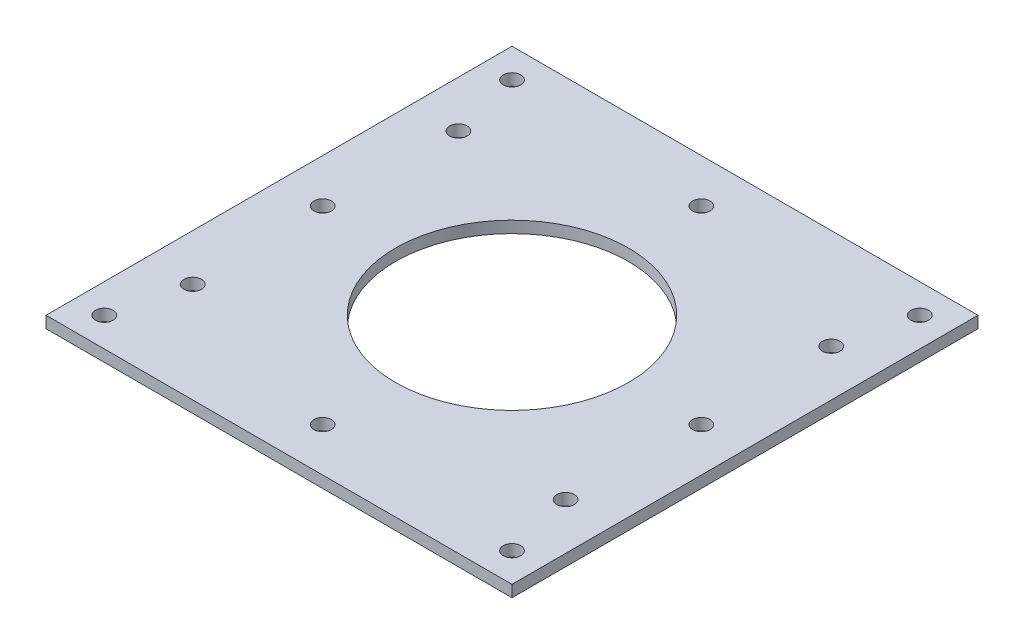
ISO-10303-21;
HEADER;
FILE_DESCRIPTION(('STEP AP214'),'2;1');
FILE_NAME('part.step','',(''),(''),'','','');
FILE_SCHEMA(('AUTOMOTIVE_DESIGN { 1 0 10303 214 1 1 1 1 }'));
ENDSEC;
DATA;
#1=APPLICATION_CONTEXT('core data for automotive mechanical design processes');
#2=APPLICATION_PROTOCOL_DEFINITION('international standard','automotive_design',2000,#1);
#3=PRODUCT_CONTEXT('',#1,'mechanical');
#4=PRODUCT('Part','Part','',(#3));
#5=PRODUCT_RELATED_PRODUCT_CATEGORY('part','',(#4));
#6=PRODUCT_DEFINITION_FORMATION('','',#4);
#7=PRODUCT_DEFINITION_CONTEXT('part definition',#1,'design');
#8=PRODUCT_DEFINITION('design','',#6,#7);
#9=PRODUCT_DEFINITION_SHAPE('','',#8);
#10=(LENGTH_UNIT() NAMED_UNIT(*) SI_UNIT(.MILLI.,.METRE.));
#11=(NAMED_UNIT(*) PLANE_ANGLE_UNIT() SI_UNIT($,.RADIAN.));
#12=(NAMED_UNIT(*) SI_UNIT($,.STERADIAN.) SOLID_ANGLE_UNIT());
#13=UNCERTAINTY_MEASURE_WITH_UNIT(LENGTH_MEASURE(1.E-05),#10,'distance_accuracy_value','');
#14=(GEOMETRIC_REPRESENTATION_CONTEXT(3) GLOBAL_UNCERTAINTY_ASSIGNED_CONTEXT((#13)) GLOBAL_UNIT_ASSIGNED_CONTEXT((#10,
#11,#12)) REPRESENTATION_CONTEXT('',''));
#15=CARTESIAN_POINT('',(0.,0.,0.));
#16=DIRECTION('',(0.,0.,1.));
#17=DIRECTION('',(1.,0.,0.));
#18=AXIS2_PLACEMENT_3D('',#15,#16,#17);
#19=CARTESIAN_POINT('',(0.,2.,0.));
#20=DIRECTION('',(1.,0.,0.));
#21=DIRECTION('',(0.,0.,-1.));
#22=AXIS2_PLACEMENT_3D('',#19,#20,#21);
#23=PLANE('',#22);
#24=DIRECTION('',(0.,0.,1.));
#25=VECTOR('',#24,1.);
#26=CARTESIAN_POINT('',(0.,0.,0.));
#27=LINE('',#26,#25);
#28=CARTESIAN_POINT('',(0.,0.,-80.));
#29=VERTEX_POINT('',#28);
#30=CARTESIAN_POINT('',(0.,0.,0.));
#31=VERTEX_POINT('',#30);
#32=EDGE_CURVE('E104',#29,#31,#27,.T.);
#33=ORIENTED_EDGE('',*,*,#32,.T.);
#34=DIRECTION('',(0.,-1.,0.));
#35=VECTOR('',#34,1.);
#36=CARTESIAN_POINT('',(0.,2.,0.));
#37=LINE('',#36,#35);
#38=CARTESIAN_POINT('',(0.,2.,0.));
#39=VERTEX_POINT('',#38);
#40=EDGE_CURVE('E11',#39,#31,#37,.T.);
#41=ORIENTED_EDGE('',*,*,#40,.F.);
#42=DIRECTION('',(0.,0.,1.));
#43=VECTOR('',#42,1.);
#44=CARTESIAN_POINT('',(0.,2.,0.));
#45=LINE('',#44,#43);
#46=CARTESIAN_POINT('',(0.,2.,-80.));
#47=VERTEX_POINT('',#46);
#48=EDGE_CURVE('E92',#47,#39,#45,.T.);
#49=ORIENTED_EDGE('',*,*,#48,.F.);
#50=DIRECTION('',(0.,-1.,0.));
#51=VECTOR('',#50,1.);
#52=CARTESIAN_POINT('',(0.,2.,-80.));
#53=LINE('',#52,#51);
#54=EDGE_CURVE('E100',#47,#29,#53,.T.);
#55=ORIENTED_EDGE('',*,*,#54,.T.);
#56=EDGE_LOOP('',(#33,#41,#49,#55));
#57=FACE_BOUND('',#56,.T.);
#58=ADVANCED_FACE('F41',(#57),#23,.F.);
#59=CARTESIAN_POINT('',(0.,2.,0.));
#60=DIRECTION('',(0.,0.,-1.));
#61=DIRECTION('',(-1.,0.,0.));
#62=AXIS2_PLACEMENT_3D('',#59,#60,#61);
#63=PLANE('',#62);
#64=DIRECTION('',(1.,0.,0.));
#65=VECTOR('',#64,1.);
#66=CARTESIAN_POINT('',(0.,0.,0.));
#67=LINE('',#66,#65);
#68=CARTESIAN_POINT('',(80.,0.,0.));
#69=VERTEX_POINT('',#68);
#70=EDGE_CURVE('E96',#31,#69,#67,.T.);
#71=ORIENTED_EDGE('',*,*,#70,.T.);
#72=DIRECTION('',(0.,-1.,0.));
#73=VECTOR('',#72,1.);
#74=CARTESIAN_POINT('',(80.,2.,0.));
#75=LINE('',#74,#73);
#76=CARTESIAN_POINT('',(80.,2.,0.));
#77=VERTEX_POINT('',#76);
#78=EDGE_CURVE('E49',#77,#69,#75,.T.);
#79=ORIENTED_EDGE('',*,*,#78,.F.);
#80=DIRECTION('',(1.,0.,0.));
#81=VECTOR('',#80,1.);
#82=CARTESIAN_POINT('',(0.,2.,0.));
#83=LINE('',#82,#81);
#84=EDGE_CURVE('E87',#39,#77,#83,.T.);
#85=ORIENTED_EDGE('',*,*,#84,.F.);
#86=ORIENTED_EDGE('',*,*,#40,.T.);
#87=EDGE_LOOP('',(#71,#79,#85,#86));
#88=FACE_BOUND('',#87,.T.);
#89=ADVANCED_FACE('F95',(#88),#63,.F.);
#90=CARTESIAN_POINT('',(80.,2.,0.));
#91=DIRECTION('',(-1.,0.,0.));
#92=DIRECTION('',(0.,0.,1.));
#93=AXIS2_PLACEMENT_3D('',#90,#91,#92);
#94=PLANE('',#93);
#95=DIRECTION('',(0.,0.,-1.));
#96=VECTOR('',#95,1.);
#97=CARTESIAN_POINT('',(80.,0.,0.));
#98=LINE('',#97,#96);
#99=CARTESIAN_POINT('',(80.,0.,-80.));
#100=VERTEX_POINT('',#99);
#101=EDGE_CURVE('E74',#69,#100,#98,.T.);
#102=ORIENTED_EDGE('',*,*,#101,.T.);
#103=DIRECTION('',(0.,-1.,0.));
#104=VECTOR('',#103,1.);
#105=CARTESIAN_POINT('',(80.,2.,-80.));
#106=LINE('',#105,#104);
#107=CARTESIAN_POINT('',(80.,2.,-80.));
#108=VERTEX_POINT('',#107);
#109=EDGE_CURVE('E97',#108,#100,#106,.T.);
#110=ORIENTED_EDGE('',*,*,#109,.F.);
#111=DIRECTION('',(0.,0.,-1.));
#112=VECTOR('',#111,1.);
#113=CARTESIAN_POINT('',(80.,2.,0.));
#114=LINE('',#113,#112);
#115=EDGE_CURVE('E90',#77,#108,#114,.T.);
#116=ORIENTED_EDGE('',*,*,#115,.F.);
#117=ORIENTED_EDGE('',*,*,#78,.T.);
#118=EDGE_LOOP('',(#102,#110,#116,#117));
#119=FACE_BOUND('',#118,.T.);
#120=ADVANCED_FACE('F98',(#119),#94,.F.);
#121=CARTESIAN_POINT('',(0.,2.,-80.));
#122=DIRECTION('',(0.,0.,1.));
#123=DIRECTION('',(1.,0.,0.));
#124=AXIS2_PLACEMENT_3D('',#121,#122,#123);
#125=PLANE('',#124);
#126=DIRECTION('',(-1.,0.,0.));
#127=VECTOR('',#126,1.);
#128=CARTESIAN_POINT('',(0.,0.,-80.));
#129=LINE('',#128,#127);
#130=EDGE_CURVE('E80',#100,#29,#129,.T.);
#131=ORIENTED_EDGE('',*,*,#130,.T.);
#132=ORIENTED_EDGE('',*,*,#54,.F.);
#133=DIRECTION('',(-1.,0.,0.));
#134=VECTOR('',#133,1.);
#135=CARTESIAN_POINT('',(0.,2.,-80.));
#136=LINE('',#135,#134);
#137=EDGE_CURVE('E57',#108,#47,#136,.T.);
#138=ORIENTED_EDGE('',*,*,#137,.F.);
#139=ORIENTED_EDGE('',*,*,#109,.T.);
#140=EDGE_LOOP('',(#131,#132,#138,#139));
#141=FACE_BOUND('',#140,.T.);
#142=ADVANCED_FACE('F112',(#141),#125,.F.);
#143=CARTESIAN_POINT('',(0.,2.,0.));
#144=DIRECTION('',(0.,-1.,0.));
#145=DIRECTION('',(0.,0.,-1.));
#146=AXIS2_PLACEMENT_3D('',#143,#144,#145);
#147=PLANE('',#146);
#148=CARTESIAN_POINT('',(40.,2.,-72.5));
#149=DIRECTION('',(0.,1.,0.));
#150=DIRECTION('',(0.,0.,1.));
#151=AXIS2_PLACEMENT_3D('',#148,#149,#150);
#152=CIRCLE('',#151,1.5);
#153=CARTESIAN_POINT('',(40.,2.,-71.));
#154=VERTEX_POINT('',#153);
#155=EDGE_CURVE('E169',#154,#154,#152,.T.);
#156=ORIENTED_EDGE('',*,*,#155,.F.);
#157=EDGE_LOOP('',(#156));
#158=FACE_BOUND('',#157,.T.);
#159=CARTESIAN_POINT('',(72.5,2.,-40.));
#160=DIRECTION('',(0.,1.,0.));
#161=DIRECTION('',(0.,0.,1.));
#162=AXIS2_PLACEMENT_3D('',#159,#160,#161);
#163=CIRCLE('',#162,1.5);
#164=CARTESIAN_POINT('',(72.5,2.,-38.5));
#165=VERTEX_POINT('',#164);
#166=EDGE_CURVE('E175',#165,#165,#163,.T.);
#167=ORIENTED_EDGE('',*,*,#166,.F.);
#168=EDGE_LOOP('',(#167));
#169=FACE_BOUND('',#168,.T.);
#170=CARTESIAN_POINT('',(40.,2.,-7.49999999999999));
#171=DIRECTION('',(0.,1.,0.));
#172=DIRECTION('',(0.,0.,1.));
#173=AXIS2_PLACEMENT_3D('',#170,#171,#172);
#174=CIRCLE('',#173,1.50000000000001);
#175=CARTESIAN_POINT('',(40.,2.,-5.99999999999997));
#176=VERTEX_POINT('',#175);
#177=EDGE_CURVE('E176',#176,#176,#174,.T.);
#178=ORIENTED_EDGE('',*,*,#177,.F.);
#179=EDGE_LOOP('',(#178));
#180=FACE_BOUND('',#179,.T.);
#181=CARTESIAN_POINT('',(7.5,2.,-40.));
#182=DIRECTION('',(0.,1.,0.));
#183=DIRECTION('',(0.,0.,1.));
#184=AXIS2_PLACEMENT_3D('',#181,#182,#183);
#185=CIRCLE('',#184,1.5);
#186=CARTESIAN_POINT('',(7.5,2.,-38.5));
#187=VERTEX_POINT('',#186);
#188=EDGE_CURVE('E187',#187,#187,#185,.T.);
#189=ORIENTED_EDGE('',*,*,#188,.F.);
#190=EDGE_LOOP('',(#189));
#191=FACE_BOUND('',#190,.T.);
#192=CARTESIAN_POINT('',(40.,2.,-40.));
#193=DIRECTION('',(0.,1.,0.));
#194=DIRECTION('',(0.,0.,1.));
#195=AXIS2_PLACEMENT_3D('',#192,#193,#194);
#196=CIRCLE('',#195,20.);
#197=CARTESIAN_POINT('',(40.,2.,-20.));
#198=VERTEX_POINT('',#197);
#199=EDGE_CURVE('E166',#198,#198,#196,.T.);
#200=ORIENTED_EDGE('',*,*,#199,.F.);
#201=EDGE_LOOP('',(#200));
#202=FACE_BOUND('',#201,.T.);
#203=CARTESIAN_POINT('',(8.,2.,-62.8));
#204=DIRECTION('',(0.,-1.,0.));
#205=DIRECTION('',(0.,0.,-1.));
#206=AXIS2_PLACEMENT_3D('',#203,#204,#205);
#207=CIRCLE('',#206,1.5);
#208=CARTESIAN_POINT('',(8.,2.,-64.3));
#209=VERTEX_POINT('',#208);
#210=EDGE_CURVE('E161',#209,#209,#207,.T.);
#211=ORIENTED_EDGE('',*,*,#210,.T.);
#212=EDGE_LOOP('',(#211));
#213=FACE_BOUND('',#212,.T.);
#214=CARTESIAN_POINT('',(72.,2.,-62.8));
#215=DIRECTION('',(0.,-1.,0.));
#216=DIRECTION('',(0.,0.,-1.));
#217=AXIS2_PLACEMENT_3D('',#214,#215,#216);
#218=CIRCLE('',#217,1.49999999999998);
#219=CARTESIAN_POINT('',(72.,2.,-64.3));
#220=VERTEX_POINT('',#219);
#221=EDGE_CURVE('E154',#220,#220,#218,.T.);
#222=ORIENTED_EDGE('',*,*,#221,.T.);
#223=EDGE_LOOP('',(#222));
#224=FACE_BOUND('',#223,.T.);
#225=CARTESIAN_POINT('',(8.,2.,-17.2));
#226=DIRECTION('',(0.,1.,0.));
#227=DIRECTION('',(0.,0.,1.));
#228=AXIS2_PLACEMENT_3D('',#225,#226,#227);
#229=CIRCLE('',#228,1.5);
#230=CARTESIAN_POINT('',(8.,2.,-15.7));
#231=VERTEX_POINT('',#230);
#232=EDGE_CURVE('E149',#231,#231,#229,.T.);
#233=ORIENTED_EDGE('',*,*,#232,.F.);
#234=EDGE_LOOP('',(#233));
#235=FACE_BOUND('',#234,.T.);
#236=CARTESIAN_POINT('',(72.,2.,-17.2));
#237=DIRECTION('',(0.,1.,0.));
#238=DIRECTION('',(0.,0.,1.));
#239=AXIS2_PLACEMENT_3D('',#236,#237,#238);
#240=CIRCLE('',#239,1.49999999999998);
#241=CARTESIAN_POINT('',(72.,2.,-15.7));
#242=VERTEX_POINT('',#241);
#243=EDGE_CURVE('E145',#242,#242,#240,.T.);
#244=ORIENTED_EDGE('',*,*,#243,.F.);
#245=EDGE_LOOP('',(#244));
#246=FACE_BOUND('',#245,.T.);
#247=CARTESIAN_POINT('',(5.,2.,-75.));
#248=DIRECTION('',(0.,-1.,0.));
#249=DIRECTION('',(0.,0.,1.));
#250=AXIS2_PLACEMENT_3D('',#247,#248,#249);
#251=CIRCLE('',#250,1.5);
#252=CARTESIAN_POINT('',(5.,2.,-73.5));
#253=VERTEX_POINT('',#252);
#254=EDGE_CURVE('E124',#253,#253,#251,.T.);
#255=ORIENTED_EDGE('',*,*,#254,.T.);
#256=EDGE_LOOP('',(#255));
#257=FACE_BOUND('',#256,.T.);
#258=CARTESIAN_POINT('',(75.,2.,-75.));
#259=DIRECTION('',(0.,-1.,0.));
#260=DIRECTION('',(0.,0.,-1.));
#261=AXIS2_PLACEMENT_3D('',#258,#259,#260);
#262=CIRCLE('',#261,1.50000000000001);
#263=CARTESIAN_POINT('',(75.,2.,-76.5));
#264=VERTEX_POINT('',#263);
#265=EDGE_CURVE('E131',#264,#264,#262,.T.);
#266=ORIENTED_EDGE('',*,*,#265,.T.);
#267=EDGE_LOOP('',(#266));
#268=FACE_BOUND('',#267,.T.);
#269=CARTESIAN_POINT('',(75.,2.,-5.));
#270=DIRECTION('',(0.,-1.,0.));
#271=DIRECTION('',(0.,0.,1.));
#272=AXIS2_PLACEMENT_3D('',#269,#270,#271);
#273=CIRCLE('',#272,1.50000000000001);
#274=CARTESIAN_POINT('',(75.,2.,-3.49999999999998));
#275=VERTEX_POINT('',#274);
#276=EDGE_CURVE('E137',#275,#275,#273,.T.);
#277=ORIENTED_EDGE('',*,*,#276,.T.);
#278=EDGE_LOOP('',(#277));
#279=FACE_BOUND('',#278,.T.);
#280=CARTESIAN_POINT('',(5.,2.,-5.));
#281=DIRECTION('',(0.,-1.,0.));
#282=DIRECTION('',(0.,0.,-1.));
#283=AXIS2_PLACEMENT_3D('',#280,#281,#282);
#284=CIRCLE('',#283,1.5);
#285=CARTESIAN_POINT('',(5.,2.,-6.5));
#286=VERTEX_POINT('',#285);
#287=EDGE_CURVE('E107',#286,#286,#284,.T.);
#288=ORIENTED_EDGE('',*,*,#287,.T.);
#289=EDGE_LOOP('',(#288));
#290=FACE_BOUND('',#289,.T.);
#291=ORIENTED_EDGE('',*,*,#48,.T.);
#292=ORIENTED_EDGE('',*,*,#84,.T.);
#293=ORIENTED_EDGE('',*,*,#115,.T.);
#294=ORIENTED_EDGE('',*,*,#137,.T.);
#295=EDGE_LOOP('',(#291,#292,#293,#294));
#296=FACE_BOUND('',#295,.T.);
#297=ADVANCED_FACE('F88',(#158,#169,#180,#191,#202,#213,#224,#235,#246,#257,#268,#279,#290,
#296),#147,.F.);
#298=CARTESIAN_POINT('',(0.,0.,0.));
#299=DIRECTION('',(0.,-1.,0.));
#300=DIRECTION('',(0.,0.,-1.));
#301=AXIS2_PLACEMENT_3D('',#298,#299,#300);
#302=PLANE('',#301);
#303=CARTESIAN_POINT('',(40.,0.,-72.5));
#304=DIRECTION('',(0.,1.,0.));
#305=DIRECTION('',(0.,0.,1.));
#306=AXIS2_PLACEMENT_3D('',#303,#304,#305);
#307=CIRCLE('',#306,1.5);
#308=CARTESIAN_POINT('',(40.,0.,-71.));
#309=VERTEX_POINT('',#308);
#310=EDGE_CURVE('E179',#309,#309,#307,.T.);
#311=ORIENTED_EDGE('',*,*,#310,.T.);
#312=EDGE_LOOP('',(#311));
#313=FACE_BOUND('',#312,.T.);
#314=CARTESIAN_POINT('',(72.5,0.,-40.));
#315=DIRECTION('',(0.,1.,0.));
#316=DIRECTION('',(0.,0.,1.));
#317=AXIS2_PLACEMENT_3D('',#314,#315,#316);
#318=CIRCLE('',#317,1.5);
#319=CARTESIAN_POINT('',(72.5,0.,-38.5));
#320=VERTEX_POINT('',#319);
#321=EDGE_CURVE('E172',#320,#320,#318,.T.);
#322=ORIENTED_EDGE('',*,*,#321,.T.);
#323=EDGE_LOOP('',(#322));
#324=FACE_BOUND('',#323,.T.);
#325=CARTESIAN_POINT('',(40.,0.,-7.49999999999999));
#326=DIRECTION('',(0.,1.,0.));
#327=DIRECTION('',(0.,0.,1.));
#328=AXIS2_PLACEMENT_3D('',#325,#326,#327);
#329=CIRCLE('',#328,1.50000000000001);
#330=CARTESIAN_POINT('',(40.,0.,-5.99999999999997));
#331=VERTEX_POINT('',#330);
#332=EDGE_CURVE('E190',#331,#331,#329,.T.);
#333=ORIENTED_EDGE('',*,*,#332,.T.);
#334=EDGE_LOOP('',(#333));
#335=FACE_BOUND('',#334,.T.);
#336=CARTESIAN_POINT('',(7.5,0.,-40.));
#337=DIRECTION('',(0.,1.,0.));
#338=DIRECTION('',(0.,0.,1.));
#339=AXIS2_PLACEMENT_3D('',#336,#337,#338);
#340=CIRCLE('',#339,1.5);
#341=CARTESIAN_POINT('',(7.5,0.,-38.5));
#342=VERTEX_POINT('',#341);
#343=EDGE_CURVE('E184',#342,#342,#340,.T.);
#344=ORIENTED_EDGE('',*,*,#343,.T.);
#345=EDGE_LOOP('',(#344));
#346=FACE_BOUND('',#345,.T.);
#347=CARTESIAN_POINT('',(40.,0.,-40.));
#348=DIRECTION('',(0.,1.,0.));
#349=DIRECTION('',(0.,0.,1.));
#350=AXIS2_PLACEMENT_3D('',#347,#348,#349);
#351=CIRCLE('',#350,20.);
#352=CARTESIAN_POINT('',(40.,0.,-20.));
#353=VERTEX_POINT('',#352);
#354=EDGE_CURVE('E158',#353,#353,#351,.T.);
#355=ORIENTED_EDGE('',*,*,#354,.T.);
#356=EDGE_LOOP('',(#355));
#357=FACE_BOUND('',#356,.T.);
#358=CARTESIAN_POINT('',(8.,0.,-62.8));
#359=DIRECTION('',(0.,-1.,0.));
#360=DIRECTION('',(0.,0.,-1.));
#361=AXIS2_PLACEMENT_3D('',#358,#359,#360);
#362=CIRCLE('',#361,1.5);
#363=CARTESIAN_POINT('',(8.,0.,-64.3));
#364=VERTEX_POINT('',#363);
#365=EDGE_CURVE('E146',#364,#364,#362,.T.);
#366=ORIENTED_EDGE('',*,*,#365,.F.);
#367=EDGE_LOOP('',(#366));
#368=FACE_BOUND('',#367,.T.);
#369=CARTESIAN_POINT('',(72.,0.,-62.8));
#370=DIRECTION('',(0.,-1.,0.));
#371=DIRECTION('',(0.,0.,-1.));
#372=AXIS2_PLACEMENT_3D('',#369,#370,#371);
#373=CIRCLE('',#372,1.49999999999998);
#374=CARTESIAN_POINT('',(72.,0.,-64.3));
#375=VERTEX_POINT('',#374);
#376=EDGE_CURVE('E157',#375,#375,#373,.T.);
#377=ORIENTED_EDGE('',*,*,#376,.F.);
#378=EDGE_LOOP('',(#377));
#379=FACE_BOUND('',#378,.T.);
#380=CARTESIAN_POINT('',(8.,0.,-17.2));
#381=DIRECTION('',(0.,1.,0.));
#382=DIRECTION('',(0.,0.,1.));
#383=AXIS2_PLACEMENT_3D('',#380,#381,#382);
#384=CIRCLE('',#383,1.5);
#385=CARTESIAN_POINT('',(8.,0.,-15.7));
#386=VERTEX_POINT('',#385);
#387=EDGE_CURVE('E128',#386,#386,#384,.T.);
#388=ORIENTED_EDGE('',*,*,#387,.T.);
#389=EDGE_LOOP('',(#388));
#390=FACE_BOUND('',#389,.T.);
#391=CARTESIAN_POINT('',(72.,0.,-17.2));
#392=DIRECTION('',(0.,1.,0.));
#393=DIRECTION('',(0.,0.,1.));
#394=AXIS2_PLACEMENT_3D('',#391,#392,#393);
#395=CIRCLE('',#394,1.49999999999998);
#396=CARTESIAN_POINT('',(72.,0.,-15.7));
#397=VERTEX_POINT('',#396);
#398=EDGE_CURVE('E142',#397,#397,#395,.T.);
#399=ORIENTED_EDGE('',*,*,#398,.T.);
#400=EDGE_LOOP('',(#399));
#401=FACE_BOUND('',#400,.T.);
#402=CARTESIAN_POINT('',(5.,0.,-75.));
#403=DIRECTION('',(0.,-1.,0.));
#404=DIRECTION('',(0.,0.,1.));
#405=AXIS2_PLACEMENT_3D('',#402,#403,#404);
#406=CIRCLE('',#405,1.5);
#407=CARTESIAN_POINT('',(5.,0.,-73.5));
#408=VERTEX_POINT('',#407);
#409=EDGE_CURVE('E127',#408,#408,#406,.T.);
#410=ORIENTED_EDGE('',*,*,#409,.F.);
#411=EDGE_LOOP('',(#410));
#412=FACE_BOUND('',#411,.T.);
#413=CARTESIAN_POINT('',(75.,0.,-75.));
#414=DIRECTION('',(0.,-1.,0.));
#415=DIRECTION('',(0.,0.,-1.));
#416=AXIS2_PLACEMENT_3D('',#413,#414,#415);
#417=CIRCLE('',#416,1.50000000000001);
#418=CARTESIAN_POINT('',(75.,0.,-76.5));
#419=VERTEX_POINT('',#418);
#420=EDGE_CURVE('E134',#419,#419,#417,.T.);
#421=ORIENTED_EDGE('',*,*,#420,.F.);
#422=EDGE_LOOP('',(#421));
#423=FACE_BOUND('',#422,.T.);
#424=CARTESIAN_POINT('',(75.,0.,-5.));
#425=DIRECTION('',(0.,-1.,0.));
#426=DIRECTION('',(0.,0.,1.));
#427=AXIS2_PLACEMENT_3D('',#424,#425,#426);
#428=CIRCLE('',#427,1.50000000000001);
#429=CARTESIAN_POINT('',(75.,0.,-3.49999999999998));
#430=VERTEX_POINT('',#429);
#431=EDGE_CURVE('E121',#430,#430,#428,.T.);
#432=ORIENTED_EDGE('',*,*,#431,.F.);
#433=EDGE_LOOP('',(#432));
#434=FACE_BOUND('',#433,.T.);
#435=CARTESIAN_POINT('',(5.,0.,-5.));
#436=DIRECTION('',(0.,-1.,0.));
#437=DIRECTION('',(0.,0.,-1.));
#438=AXIS2_PLACEMENT_3D('',#435,#436,#437);
#439=CIRCLE('',#438,1.5);
#440=CARTESIAN_POINT('',(5.,0.,-6.5));
#441=VERTEX_POINT('',#440);
#442=EDGE_CURVE('E118',#441,#441,#439,.T.);
#443=ORIENTED_EDGE('',*,*,#442,.F.);
#444=EDGE_LOOP('',(#443));
#445=FACE_BOUND('',#444,.T.);
#446=ORIENTED_EDGE('',*,*,#32,.F.);
#447=ORIENTED_EDGE('',*,*,#130,.F.);
#448=ORIENTED_EDGE('',*,*,#101,.F.);
#449=ORIENTED_EDGE('',*,*,#70,.F.);
#450=EDGE_LOOP('',(#446,#447,#448,#449));
#451=FACE_BOUND('',#450,.T.);
#452=ADVANCED_FACE('F115',(#313,#324,#335,#346,#357,#368,#379,#390,#401,#412,#423,#434,#445,
#451),#302,.T.);
#453=CARTESIAN_POINT('',(5.,2.,-5.));
#454=DIRECTION('',(0.,-1.,0.));
#455=DIRECTION('',(0.,0.,-1.));
#456=AXIS2_PLACEMENT_3D('',#453,#454,#455);
#457=CYLINDRICAL_SURFACE('',#456,1.5);
#458=ORIENTED_EDGE('',*,*,#287,.F.);
#459=EDGE_LOOP('',(#458));
#460=FACE_BOUND('',#459,.T.);
#461=ORIENTED_EDGE('',*,*,#442,.T.);
#462=EDGE_LOOP('',(#461));
#463=FACE_BOUND('',#462,.T.);
#464=ADVANCED_FACE('F222',(#460,#463),#457,.F.);
#465=CARTESIAN_POINT('',(75.,2.,-5.));
#466=DIRECTION('',(0.,-1.,0.));
#467=DIRECTION('',(0.,0.,-1.));
#468=AXIS2_PLACEMENT_3D('',#465,#466,#467);
#469=CYLINDRICAL_SURFACE('',#468,1.50000000000001);
#470=ORIENTED_EDGE('',*,*,#276,.F.);
#471=EDGE_LOOP('',(#470));
#472=FACE_BOUND('',#471,.T.);
#473=ORIENTED_EDGE('',*,*,#431,.T.);
#474=EDGE_LOOP('',(#473));
#475=FACE_BOUND('',#474,.T.);
#476=ADVANCED_FACE('F225',(#472,#475),#469,.F.);
#477=CARTESIAN_POINT('',(75.,2.,-75.));
#478=DIRECTION('',(0.,-1.,0.));
#479=DIRECTION('',(0.,0.,-1.));
#480=AXIS2_PLACEMENT_3D('',#477,#478,#479);
#481=CYLINDRICAL_SURFACE('',#480,1.50000000000001);
#482=ORIENTED_EDGE('',*,*,#265,.F.);
#483=EDGE_LOOP('',(#482));
#484=FACE_BOUND('',#483,.T.);
#485=ORIENTED_EDGE('',*,*,#420,.T.);
#486=EDGE_LOOP('',(#485));
#487=FACE_BOUND('',#486,.T.);
#488=ADVANCED_FACE('F263',(#484,#487),#481,.F.);
#489=CARTESIAN_POINT('',(5.,2.,-75.));
#490=DIRECTION('',(0.,-1.,0.));
#491=DIRECTION('',(0.,0.,-1.));
#492=AXIS2_PLACEMENT_3D('',#489,#490,#491);
#493=CYLINDRICAL_SURFACE('',#492,1.5);
#494=ORIENTED_EDGE('',*,*,#254,.F.);
#495=EDGE_LOOP('',(#494));
#496=FACE_BOUND('',#495,.T.);
#497=ORIENTED_EDGE('',*,*,#409,.T.);
#498=EDGE_LOOP('',(#497));
#499=FACE_BOUND('',#498,.T.);
#500=ADVANCED_FACE('F272',(#496,#499),#493,.F.);
#501=CARTESIAN_POINT('',(72.,0.,-17.2));
#502=DIRECTION('',(0.,1.,0.));
#503=DIRECTION('',(0.,0.,1.));
#504=AXIS2_PLACEMENT_3D('',#501,#502,#503);
#505=CYLINDRICAL_SURFACE('',#504,1.49999999999998);
#506=ORIENTED_EDGE('',*,*,#398,.F.);
#507=EDGE_LOOP('',(#506));
#508=FACE_BOUND('',#507,.T.);
#509=ORIENTED_EDGE('',*,*,#243,.T.);
#510=EDGE_LOOP('',(#509));
#511=FACE_BOUND('',#510,.T.);
#512=ADVANCED_FACE('F281',(#508,#511),#505,.F.);
#513=CARTESIAN_POINT('',(8.,0.,-17.2));
#514=DIRECTION('',(0.,1.,0.));
#515=DIRECTION('',(0.,0.,1.));
#516=AXIS2_PLACEMENT_3D('',#513,#514,#515);
#517=CYLINDRICAL_SURFACE('',#516,1.5);
#518=ORIENTED_EDGE('',*,*,#387,.F.);
#519=EDGE_LOOP('',(#518));
#520=FACE_BOUND('',#519,.T.);
#521=ORIENTED_EDGE('',*,*,#232,.T.);
#522=EDGE_LOOP('',(#521));
#523=FACE_BOUND('',#522,.T.);
#524=ADVANCED_FACE('F290',(#520,#523),#517,.F.);
#525=CARTESIAN_POINT('',(72.,0.,-62.8));
#526=DIRECTION('',(0.,1.,0.));
#527=DIRECTION('',(0.,0.,1.));
#528=AXIS2_PLACEMENT_3D('',#525,#526,#527);
#529=CYLINDRICAL_SURFACE('',#528,1.49999999999998);
#530=ORIENTED_EDGE('',*,*,#376,.T.);
#531=EDGE_LOOP('',(#530));
#532=FACE_BOUND('',#531,.T.);
#533=ORIENTED_EDGE('',*,*,#221,.F.);
#534=EDGE_LOOP('',(#533));
#535=FACE_BOUND('',#534,.T.);
#536=ADVANCED_FACE('F299',(#532,#535),#529,.F.);
#537=CARTESIAN_POINT('',(8.,0.,-62.8));
#538=DIRECTION('',(0.,1.,0.));
#539=DIRECTION('',(0.,0.,1.));
#540=AXIS2_PLACEMENT_3D('',#537,#538,#539);
#541=CYLINDRICAL_SURFACE('',#540,1.5);
#542=ORIENTED_EDGE('',*,*,#365,.T.);
#543=EDGE_LOOP('',(#542));
#544=FACE_BOUND('',#543,.T.);
#545=ORIENTED_EDGE('',*,*,#210,.F.);
#546=EDGE_LOOP('',(#545));
#547=FACE_BOUND('',#546,.T.);
#548=ADVANCED_FACE('F308',(#544,#547),#541,.F.);
#549=CARTESIAN_POINT('',(40.,0.,-40.));
#550=DIRECTION('',(0.,1.,0.));
#551=DIRECTION('',(0.,0.,1.));
#552=AXIS2_PLACEMENT_3D('',#549,#550,#551);
#553=CYLINDRICAL_SURFACE('',#552,20.);
#554=ORIENTED_EDGE('',*,*,#354,.F.);
#555=EDGE_LOOP('',(#554));
#556=FACE_BOUND('',#555,.T.);
#557=ORIENTED_EDGE('',*,*,#199,.T.);
#558=EDGE_LOOP('',(#557));
#559=FACE_BOUND('',#558,.T.);
#560=ADVANCED_FACE('F316',(#556,#559),#553,.F.);
#561=CARTESIAN_POINT('',(7.5,0.,-40.));
#562=DIRECTION('',(0.,1.,0.));
#563=DIRECTION('',(0.,0.,1.));
#564=AXIS2_PLACEMENT_3D('',#561,#562,#563);
#565=CYLINDRICAL_SURFACE('',#564,1.5);
#566=ORIENTED_EDGE('',*,*,#343,.F.);
#567=EDGE_LOOP('',(#566));
#568=FACE_BOUND('',#567,.T.);
#569=ORIENTED_EDGE('',*,*,#188,.T.);
#570=EDGE_LOOP('',(#569));
#571=FACE_BOUND('',#570,.T.);
#572=ADVANCED_FACE('F343',(#568,#571),#565,.F.);
#573=CARTESIAN_POINT('',(40.,0.,-7.49999999999999));
#574=DIRECTION('',(0.,1.,0.));
#575=DIRECTION('',(0.,0.,1.));
#576=AXIS2_PLACEMENT_3D('',#573,#574,#575);
#577=CYLINDRICAL_SURFACE('',#576,1.50000000000001);
#578=ORIENTED_EDGE('',*,*,#332,.F.);
#579=EDGE_LOOP('',(#578));
#580=FACE_BOUND('',#579,.T.);
#581=ORIENTED_EDGE('',*,*,#177,.T.);
#582=EDGE_LOOP('',(#581));
#583=FACE_BOUND('',#582,.T.);
#584=ADVANCED_FACE('F196',(#580,#583),#577,.F.);
#585=CARTESIAN_POINT('',(72.5,0.,-40.));
#586=DIRECTION('',(0.,1.,0.));
#587=DIRECTION('',(0.,0.,1.));
#588=AXIS2_PLACEMENT_3D('',#585,#586,#587);
#589=CYLINDRICAL_SURFACE('',#588,1.5);
#590=ORIENTED_EDGE('',*,*,#321,.F.);
#591=EDGE_LOOP('',(#590));
#592=FACE_BOUND('',#591,.T.);
#593=ORIENTED_EDGE('',*,*,#166,.T.);
#594=EDGE_LOOP('',(#593));
#595=FACE_BOUND('',#594,.T.);
#596=ADVANCED_FACE('F360',(#592,#595),#589,.F.);
#597=CARTESIAN_POINT('',(40.,0.,-72.5));
#598=DIRECTION('',(0.,1.,0.));
#599=DIRECTION('',(0.,0.,1.));
#600=AXIS2_PLACEMENT_3D('',#597,#598,#599);
#601=CYLINDRICAL_SURFACE('',#600,1.5);
#602=ORIENTED_EDGE('',*,*,#310,.F.);
#603=EDGE_LOOP('',(#602));
#604=FACE_BOUND('',#603,.T.);
#605=ORIENTED_EDGE('',*,*,#155,.T.);
#606=EDGE_LOOP('',(#605));
#607=FACE_BOUND('',#606,.T.);
#608=ADVANCED_FACE('F369',(#604,#607),#601,.F.);
#609=CLOSED_SHELL('',(#58,#89,#120,#142,#297,#452,#464,#476,#488,#500,#512,#524,#536,#548,#560,
#572,#584,#596,#608));
#610=MANIFOLD_SOLID_BREP('B2',#609);
#611=ADVANCED_BREP_SHAPE_REPRESENTATION('',(#18,#610),#14);
#612=SHAPE_DEFINITION_REPRESENTATION(#9,#611);
ENDSEC;
END-ISO-10303-21;
